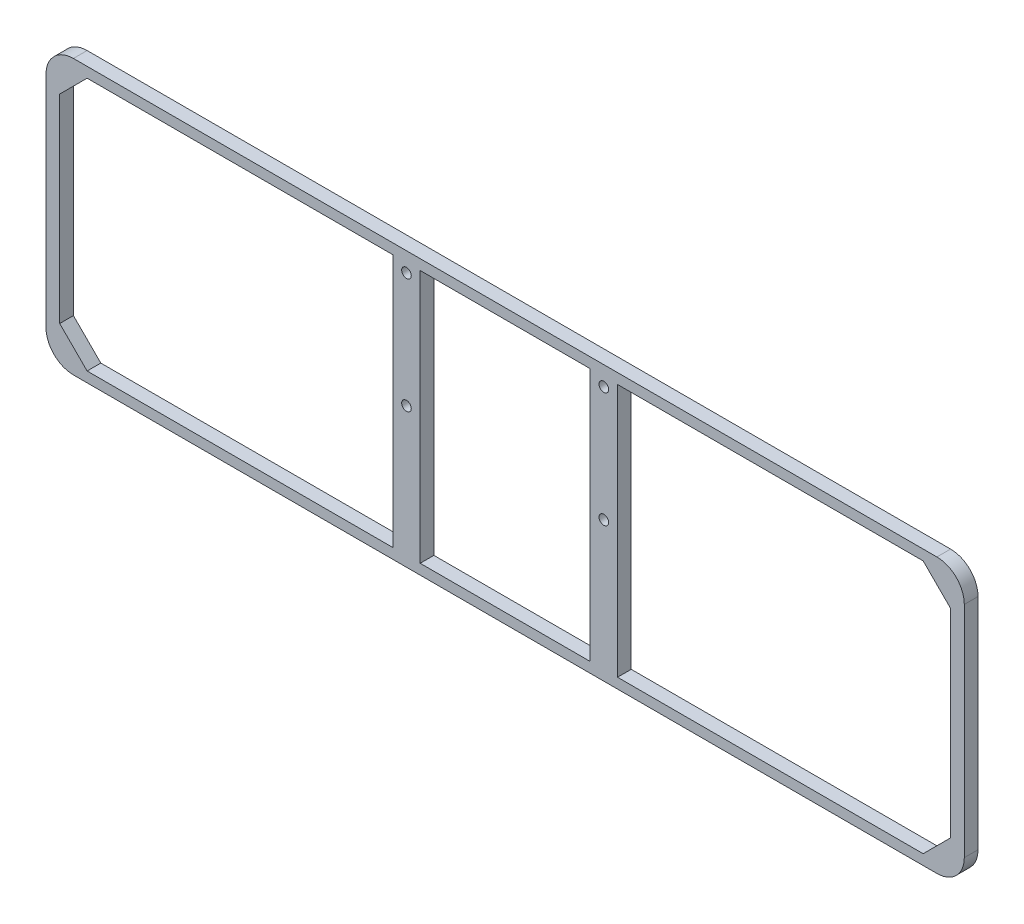
ISO-10303-21;
HEADER;
FILE_DESCRIPTION(('STEP AP214'),'2;1');
FILE_NAME('part.step','',(''),(''),'','','');
FILE_SCHEMA(('AUTOMOTIVE_DESIGN { 1 0 10303 214 1 1 1 1 }'));
ENDSEC;
DATA;
#1=APPLICATION_CONTEXT('core data for automotive mechanical design processes');
#2=APPLICATION_PROTOCOL_DEFINITION('international standard','automotive_design',2000,#1);
#3=PRODUCT_CONTEXT('',#1,'mechanical');
#4=PRODUCT('Part','Part','',(#3));
#5=PRODUCT_RELATED_PRODUCT_CATEGORY('part','',(#4));
#6=PRODUCT_DEFINITION_FORMATION('','',#4);
#7=PRODUCT_DEFINITION_CONTEXT('part definition',#1,'design');
#8=PRODUCT_DEFINITION('design','',#6,#7);
#9=PRODUCT_DEFINITION_SHAPE('','',#8);
#10=(LENGTH_UNIT() NAMED_UNIT(*) SI_UNIT(.MILLI.,.METRE.));
#11=(NAMED_UNIT(*) PLANE_ANGLE_UNIT() SI_UNIT($,.RADIAN.));
#12=(NAMED_UNIT(*) SI_UNIT($,.STERADIAN.) SOLID_ANGLE_UNIT());
#13=UNCERTAINTY_MEASURE_WITH_UNIT(LENGTH_MEASURE(1.E-05),#10,'distance_accuracy_value','');
#14=(GEOMETRIC_REPRESENTATION_CONTEXT(3) GLOBAL_UNCERTAINTY_ASSIGNED_CONTEXT((#13)) GLOBAL_UNIT_ASSIGNED_CONTEXT((#10,
#11,#12)) REPRESENTATION_CONTEXT('',''));
#15=CARTESIAN_POINT('',(0.,0.,0.));
#16=DIRECTION('',(0.,0.,1.));
#17=DIRECTION('',(1.,0.,0.));
#18=AXIS2_PLACEMENT_3D('',#15,#16,#17);
#19=CARTESIAN_POINT('',(167.5,-50.,-5.));
#20=DIRECTION('',(1.,0.,0.));
#21=DIRECTION('',(0.,0.,-1.));
#22=AXIS2_PLACEMENT_3D('',#19,#20,#21);
#23=PLANE('',#22);
#24=DIRECTION('',(0.,1.,0.));
#25=VECTOR('',#24,1.);
#26=CARTESIAN_POINT('',(167.5,-50.,0.));
#27=LINE('',#26,#25);
#28=CARTESIAN_POINT('',(167.5,-40.,0.));
#29=VERTEX_POINT('',#28);
#30=CARTESIAN_POINT('',(167.5,40.,0.));
#31=VERTEX_POINT('',#30);
#32=EDGE_CURVE('E332',#29,#31,#27,.T.);
#33=ORIENTED_EDGE('',*,*,#32,.F.);
#34=DIRECTION('',(0.,0.,1.));
#35=VECTOR('',#34,1.);
#36=CARTESIAN_POINT('',(167.5,-40.,-5.));
#37=LINE('',#36,#35);
#38=CARTESIAN_POINT('',(167.5,-40.,-5.));
#39=VERTEX_POINT('',#38);
#40=EDGE_CURVE('E390',#29,#39,#37,.F.);
#41=ORIENTED_EDGE('',*,*,#40,.T.);
#42=DIRECTION('',(0.,1.,0.));
#43=VECTOR('',#42,1.);
#44=CARTESIAN_POINT('',(167.5,-50.,-5.));
#45=LINE('',#44,#43);
#46=CARTESIAN_POINT('',(167.5,40.,-5.));
#47=VERTEX_POINT('',#46);
#48=EDGE_CURVE('E336',#39,#47,#45,.T.);
#49=ORIENTED_EDGE('',*,*,#48,.T.);
#50=DIRECTION('',(0.,0.,1.));
#51=VECTOR('',#50,1.);
#52=CARTESIAN_POINT('',(167.5,40.,-5.));
#53=LINE('',#52,#51);
#54=EDGE_CURVE('E386',#47,#31,#53,.T.);
#55=ORIENTED_EDGE('',*,*,#54,.T.);
#56=EDGE_LOOP('',(#33,#41,#49,#55));
#57=FACE_BOUND('',#56,.T.);
#58=ADVANCED_FACE('F42',(#57),#23,.T.);
#59=CARTESIAN_POINT('',(-167.5,-50.,-5.));
#60=DIRECTION('',(0.,-1.,0.));
#61=DIRECTION('',(0.,0.,-1.));
#62=AXIS2_PLACEMENT_3D('',#59,#60,#61);
#63=PLANE('',#62);
#64=DIRECTION('',(1.,0.,0.));
#65=VECTOR('',#64,1.);
#66=CARTESIAN_POINT('',(-167.5,-50.,-5.));
#67=LINE('',#66,#65);
#68=CARTESIAN_POINT('',(-157.5,-50.,-5.));
#69=VERTEX_POINT('',#68);
#70=CARTESIAN_POINT('',(157.5,-50.,-5.));
#71=VERTEX_POINT('',#70);
#72=EDGE_CURVE('E349',#69,#71,#67,.T.);
#73=ORIENTED_EDGE('',*,*,#72,.T.);
#74=DIRECTION('',(0.,0.,1.));
#75=VECTOR('',#74,1.);
#76=CARTESIAN_POINT('',(157.5,-50.,-5.));
#77=LINE('',#76,#75);
#78=CARTESIAN_POINT('',(157.5,-50.,0.));
#79=VERTEX_POINT('',#78);
#80=EDGE_CURVE('E370',#71,#79,#77,.T.);
#81=ORIENTED_EDGE('',*,*,#80,.T.);
#82=DIRECTION('',(1.,0.,0.));
#83=VECTOR('',#82,1.);
#84=CARTESIAN_POINT('',(-167.5,-50.,0.));
#85=LINE('',#84,#83);
#86=CARTESIAN_POINT('',(-157.5,-50.,0.));
#87=VERTEX_POINT('',#86);
#88=EDGE_CURVE('E341',#87,#79,#85,.T.);
#89=ORIENTED_EDGE('',*,*,#88,.F.);
#90=DIRECTION('',(0.,0.,1.));
#91=VECTOR('',#90,1.);
#92=CARTESIAN_POINT('',(-157.5,-50.,-5.));
#93=LINE('',#92,#91);
#94=EDGE_CURVE('E353',#87,#69,#93,.F.);
#95=ORIENTED_EDGE('',*,*,#94,.T.);
#96=EDGE_LOOP('',(#73,#81,#89,#95));
#97=FACE_BOUND('',#96,.T.);
#98=ADVANCED_FACE('F500',(#97),#63,.T.);
#99=CARTESIAN_POINT('',(-167.5,-50.,-5.));
#100=DIRECTION('',(-1.,0.,0.));
#101=DIRECTION('',(0.,0.,1.));
#102=AXIS2_PLACEMENT_3D('',#99,#100,#101);
#103=PLANE('',#102);
#104=DIRECTION('',(0.,-1.,0.));
#105=VECTOR('',#104,1.);
#106=CARTESIAN_POINT('',(-167.5,-50.,0.));
#107=LINE('',#106,#105);
#108=CARTESIAN_POINT('',(-167.5,40.,0.));
#109=VERTEX_POINT('',#108);
#110=CARTESIAN_POINT('',(-167.5,-40.,0.));
#111=VERTEX_POINT('',#110);
#112=EDGE_CURVE('E361',#109,#111,#107,.T.);
#113=ORIENTED_EDGE('',*,*,#112,.F.);
#114=DIRECTION('',(0.,0.,1.));
#115=VECTOR('',#114,1.);
#116=CARTESIAN_POINT('',(-167.5,40.,-5.));
#117=LINE('',#116,#115);
#118=CARTESIAN_POINT('',(-167.5,40.,-5.));
#119=VERTEX_POINT('',#118);
#120=EDGE_CURVE('E416',#109,#119,#117,.F.);
#121=ORIENTED_EDGE('',*,*,#120,.T.);
#122=DIRECTION('',(0.,-1.,0.));
#123=VECTOR('',#122,1.);
#124=CARTESIAN_POINT('',(-167.5,-50.,-5.));
#125=LINE('',#124,#123);
#126=CARTESIAN_POINT('',(-167.5,-40.,-5.));
#127=VERTEX_POINT('',#126);
#128=EDGE_CURVE('E345',#119,#127,#125,.T.);
#129=ORIENTED_EDGE('',*,*,#128,.T.);
#130=DIRECTION('',(0.,0.,1.));
#131=VECTOR('',#130,1.);
#132=CARTESIAN_POINT('',(-167.5,-40.,-5.));
#133=LINE('',#132,#131);
#134=EDGE_CURVE('E412',#127,#111,#133,.T.);
#135=ORIENTED_EDGE('',*,*,#134,.T.);
#136=EDGE_LOOP('',(#113,#121,#129,#135));
#137=FACE_BOUND('',#136,.T.);
#138=ADVANCED_FACE('F506',(#137),#103,.T.);
#139=CARTESIAN_POINT('',(-167.5,50.,-5.));
#140=DIRECTION('',(0.,1.,0.));
#141=DIRECTION('',(0.,0.,1.));
#142=AXIS2_PLACEMENT_3D('',#139,#140,#141);
#143=PLANE('',#142);
#144=DIRECTION('',(-1.,0.,0.));
#145=VECTOR('',#144,1.);
#146=CARTESIAN_POINT('',(-167.5,50.,0.));
#147=LINE('',#146,#145);
#148=CARTESIAN_POINT('',(157.5,50.,0.));
#149=VERTEX_POINT('',#148);
#150=CARTESIAN_POINT('',(-157.5,50.,0.));
#151=VERTEX_POINT('',#150);
#152=EDGE_CURVE('E357',#149,#151,#147,.T.);
#153=ORIENTED_EDGE('',*,*,#152,.F.);
#154=DIRECTION('',(0.,0.,1.));
#155=VECTOR('',#154,1.);
#156=CARTESIAN_POINT('',(157.5,50.,-5.));
#157=LINE('',#156,#155);
#158=CARTESIAN_POINT('',(157.5,50.,-5.));
#159=VERTEX_POINT('',#158);
#160=EDGE_CURVE('E409',#149,#159,#157,.F.);
#161=ORIENTED_EDGE('',*,*,#160,.T.);
#162=DIRECTION('',(-1.,0.,0.));
#163=VECTOR('',#162,1.);
#164=CARTESIAN_POINT('',(-167.5,50.,-5.));
#165=LINE('',#164,#163);
#166=CARTESIAN_POINT('',(-157.5,50.,-5.));
#167=VERTEX_POINT('',#166);
#168=EDGE_CURVE('E340',#159,#167,#165,.T.);
#169=ORIENTED_EDGE('',*,*,#168,.T.);
#170=DIRECTION('',(0.,0.,1.));
#171=VECTOR('',#170,1.);
#172=CARTESIAN_POINT('',(-157.5,50.,-5.));
#173=LINE('',#172,#171);
#174=EDGE_CURVE('E405',#167,#151,#173,.T.);
#175=ORIENTED_EDGE('',*,*,#174,.T.);
#176=EDGE_LOOP('',(#153,#161,#169,#175));
#177=FACE_BOUND('',#176,.T.);
#178=ADVANCED_FACE('F512',(#177),#143,.T.);
#179=CARTESIAN_POINT('',(0.,0.,-5.));
#180=DIRECTION('',(0.,0.,-1.));
#181=DIRECTION('',(-1.,0.,0.));
#182=AXIS2_PLACEMENT_3D('',#179,#180,#181);
#183=PLANE('',#182);
#184=CARTESIAN_POINT('',(-35.9999999999996,0.999999999999994,-5.));
#185=DIRECTION('',(0.,0.,1.));
#186=DIRECTION('',(1.,0.,0.));
#187=AXIS2_PLACEMENT_3D('',#184,#185,#186);
#188=CIRCLE('',#187,1.75);
#189=CARTESIAN_POINT('',(-34.2499999999996,0.999999999999994,-5.));
#190=VERTEX_POINT('',#189);
#191=EDGE_CURVE('E652',#190,#190,#188,.T.);
#192=ORIENTED_EDGE('',*,*,#191,.T.);
#193=EDGE_LOOP('',(#192));
#194=FACE_BOUND('',#193,.T.);
#195=CARTESIAN_POINT('',(36.0000000000004,0.999999999999994,-5.));
#196=DIRECTION('',(0.,0.,1.));
#197=DIRECTION('',(1.,0.,0.));
#198=AXIS2_PLACEMENT_3D('',#195,#196,#197);
#199=CIRCLE('',#198,1.75);
#200=CARTESIAN_POINT('',(37.7500000000004,0.999999999999994,-5.));
#201=VERTEX_POINT('',#200);
#202=EDGE_CURVE('E662',#201,#201,#199,.T.);
#203=ORIENTED_EDGE('',*,*,#202,.T.);
#204=EDGE_LOOP('',(#203));
#205=FACE_BOUND('',#204,.T.);
#206=CARTESIAN_POINT('',(36.,43.,-5.));
#207=DIRECTION('',(0.,0.,1.));
#208=DIRECTION('',(1.,0.,0.));
#209=AXIS2_PLACEMENT_3D('',#206,#207,#208);
#210=CIRCLE('',#209,1.75);
#211=CARTESIAN_POINT('',(37.75,43.,-5.));
#212=VERTEX_POINT('',#211);
#213=EDGE_CURVE('E670',#212,#212,#210,.T.);
#214=ORIENTED_EDGE('',*,*,#213,.T.);
#215=EDGE_LOOP('',(#214));
#216=FACE_BOUND('',#215,.T.);
#217=CARTESIAN_POINT('',(-36.,43.,-5.));
#218=DIRECTION('',(0.,0.,1.));
#219=DIRECTION('',(1.,0.,0.));
#220=AXIS2_PLACEMENT_3D('',#217,#218,#219);
#221=CIRCLE('',#220,1.75);
#222=CARTESIAN_POINT('',(-34.25,43.,-5.));
#223=VERTEX_POINT('',#222);
#224=EDGE_CURVE('E248',#223,#223,#221,.T.);
#225=ORIENTED_EDGE('',*,*,#224,.T.);
#226=EDGE_LOOP('',(#225));
#227=FACE_BOUND('',#226,.T.);
#228=DIRECTION('',(0.,-1.,0.));
#229=VECTOR('',#228,1.);
#230=CARTESIAN_POINT('',(-31.,-46.25,-5.));
#231=LINE('',#230,#229);
#232=CARTESIAN_POINT('',(-31.,46.25,-5.));
#233=VERTEX_POINT('',#232);
#234=CARTESIAN_POINT('',(-31.,-46.25,-5.));
#235=VERTEX_POINT('',#234);
#236=EDGE_CURVE('E208',#233,#235,#231,.T.);
#237=ORIENTED_EDGE('',*,*,#236,.T.);
#238=DIRECTION('',(1.,0.,0.));
#239=VECTOR('',#238,1.);
#240=CARTESIAN_POINT('',(-31.,-46.25,-5.));
#241=LINE('',#240,#239);
#242=CARTESIAN_POINT('',(31.,-46.25,-5.));
#243=VERTEX_POINT('',#242);
#244=EDGE_CURVE('E221',#235,#243,#241,.T.);
#245=ORIENTED_EDGE('',*,*,#244,.T.);
#246=DIRECTION('',(0.,1.,0.));
#247=VECTOR('',#246,1.);
#248=CARTESIAN_POINT('',(31.,46.25,-5.));
#249=LINE('',#248,#247);
#250=CARTESIAN_POINT('',(31.,46.25,-5.));
#251=VERTEX_POINT('',#250);
#252=EDGE_CURVE('E226',#243,#251,#249,.T.);
#253=ORIENTED_EDGE('',*,*,#252,.T.);
#254=DIRECTION('',(-1.,0.,0.));
#255=VECTOR('',#254,1.);
#256=CARTESIAN_POINT('',(-31.,46.25,-5.));
#257=LINE('',#256,#255);
#258=EDGE_CURVE('E217',#251,#233,#257,.T.);
#259=ORIENTED_EDGE('',*,*,#258,.T.);
#260=EDGE_LOOP('',(#237,#245,#253,#259));
#261=FACE_BOUND('',#260,.T.);
#262=DIRECTION('',(-1.,0.,0.));
#263=VECTOR('',#262,1.);
#264=CARTESIAN_POINT('',(-162.5,46.25,-5.));
#265=LINE('',#264,#263);
#266=CARTESIAN_POINT('',(-41.,46.25,-5.));
#267=VERTEX_POINT('',#266);
#268=CARTESIAN_POINT('',(-152.5,46.25,-5.));
#269=VERTEX_POINT('',#268);
#270=EDGE_CURVE('E274',#267,#269,#265,.T.);
#271=ORIENTED_EDGE('',*,*,#270,.T.);
#272=DIRECTION('',(0.707106781186544,0.707106781186551,0.));
#273=VECTOR('',#272,1.);
#274=CARTESIAN_POINT('',(-162.5,36.2499999999999,-5.));
#275=LINE('',#274,#273);
#276=CARTESIAN_POINT('',(-162.5,36.2499999999999,-5.));
#277=VERTEX_POINT('',#276);
#278=EDGE_CURVE('E461',#269,#277,#275,.F.);
#279=ORIENTED_EDGE('',*,*,#278,.T.);
#280=DIRECTION('',(0.,-1.,0.));
#281=VECTOR('',#280,1.);
#282=CARTESIAN_POINT('',(-162.5,-46.25,-5.));
#283=LINE('',#282,#281);
#284=CARTESIAN_POINT('',(-162.5,-36.25,-5.));
#285=VERTEX_POINT('',#284);
#286=EDGE_CURVE('E263',#277,#285,#283,.T.);
#287=ORIENTED_EDGE('',*,*,#286,.T.);
#288=DIRECTION('',(-0.70710678118655,0.707106781186545,0.));
#289=VECTOR('',#288,1.);
#290=CARTESIAN_POINT('',(-152.5,-46.25,-5.));
#291=LINE('',#290,#289);
#292=CARTESIAN_POINT('',(-152.5,-46.25,-5.));
#293=VERTEX_POINT('',#292);
#294=EDGE_CURVE('E11',#285,#293,#291,.F.);
#295=ORIENTED_EDGE('',*,*,#294,.T.);
#296=DIRECTION('',(1.,0.,0.));
#297=VECTOR('',#296,1.);
#298=CARTESIAN_POINT('',(-162.5,-46.25,-5.));
#299=LINE('',#298,#297);
#300=CARTESIAN_POINT('',(-41.,-46.25,-5.));
#301=VERTEX_POINT('',#300);
#302=EDGE_CURVE('E266',#293,#301,#299,.T.);
#303=ORIENTED_EDGE('',*,*,#302,.T.);
#304=DIRECTION('',(0.,1.,0.));
#305=VECTOR('',#304,1.);
#306=CARTESIAN_POINT('',(-41.,-46.25,-5.));
#307=LINE('',#306,#305);
#308=EDGE_CURVE('E270',#301,#267,#307,.T.);
#309=ORIENTED_EDGE('',*,*,#308,.T.);
#310=EDGE_LOOP('',(#271,#279,#287,#295,#303,#309));
#311=FACE_BOUND('',#310,.T.);
#312=DIRECTION('',(0.,1.,0.));
#313=VECTOR('',#312,1.);
#314=CARTESIAN_POINT('',(162.5,-46.25,-5.));
#315=LINE('',#314,#313);
#316=CARTESIAN_POINT('',(162.5,-36.2499999999999,-5.));
#317=VERTEX_POINT('',#316);
#318=CARTESIAN_POINT('',(162.5,36.2500000000001,-5.));
#319=VERTEX_POINT('',#318);
#320=EDGE_CURVE('E311',#317,#319,#315,.T.);
#321=ORIENTED_EDGE('',*,*,#320,.T.);
#322=DIRECTION('',(0.70710678118655,-0.707106781186545,0.));
#323=VECTOR('',#322,1.);
#324=CARTESIAN_POINT('',(152.5,46.25,-5.));
#325=LINE('',#324,#323);
#326=CARTESIAN_POINT('',(152.5,46.25,-5.));
#327=VERTEX_POINT('',#326);
#328=EDGE_CURVE('E455',#319,#327,#325,.F.);
#329=ORIENTED_EDGE('',*,*,#328,.T.);
#330=DIRECTION('',(-1.,0.,0.));
#331=VECTOR('',#330,1.);
#332=CARTESIAN_POINT('',(41.,46.25,-5.));
#333=LINE('',#332,#331);
#334=CARTESIAN_POINT('',(41.,46.25,-5.));
#335=VERTEX_POINT('',#334);
#336=EDGE_CURVE('E299',#327,#335,#333,.T.);
#337=ORIENTED_EDGE('',*,*,#336,.T.);
#338=DIRECTION('',(0.,-1.,0.));
#339=VECTOR('',#338,1.);
#340=CARTESIAN_POINT('',(41.,46.25,-5.));
#341=LINE('',#340,#339);
#342=CARTESIAN_POINT('',(41.,-46.25,-5.));
#343=VERTEX_POINT('',#342);
#344=EDGE_CURVE('E302',#335,#343,#341,.T.);
#345=ORIENTED_EDGE('',*,*,#344,.T.);
#346=DIRECTION('',(1.,0.,0.));
#347=VECTOR('',#346,1.);
#348=CARTESIAN_POINT('',(41.,-46.25,-5.));
#349=LINE('',#348,#347);
#350=CARTESIAN_POINT('',(152.5,-46.25,-5.));
#351=VERTEX_POINT('',#350);
#352=EDGE_CURVE('E307',#343,#351,#349,.T.);
#353=ORIENTED_EDGE('',*,*,#352,.T.);
#354=DIRECTION('',(-0.707106781186544,-0.707106781186551,0.));
#355=VECTOR('',#354,1.);
#356=CARTESIAN_POINT('',(162.5,-36.2499999999999,-5.));
#357=LINE('',#356,#355);
#358=EDGE_CURVE('E449',#351,#317,#357,.F.);
#359=ORIENTED_EDGE('',*,*,#358,.T.);
#360=EDGE_LOOP('',(#321,#329,#337,#345,#353,#359));
#361=FACE_BOUND('',#360,.T.);
#362=ORIENTED_EDGE('',*,*,#48,.F.);
#363=CARTESIAN_POINT('',(157.5,-40.,-5.));
#364=DIRECTION('',(0.,0.,-1.));
#365=DIRECTION('',(-1.,0.,0.));
#366=AXIS2_PLACEMENT_3D('',#363,#364,#365);
#367=CIRCLE('',#366,10.);
#368=EDGE_CURVE('E402',#39,#71,#367,.T.);
#369=ORIENTED_EDGE('',*,*,#368,.T.);
#370=ORIENTED_EDGE('',*,*,#72,.F.);
#371=CARTESIAN_POINT('',(-157.5,-40.,-5.));
#372=DIRECTION('',(0.,0.,-1.));
#373=DIRECTION('',(-1.,0.,0.));
#374=AXIS2_PLACEMENT_3D('',#371,#372,#373);
#375=CIRCLE('',#374,10.);
#376=EDGE_CURVE('E393',#69,#127,#375,.T.);
#377=ORIENTED_EDGE('',*,*,#376,.T.);
#378=ORIENTED_EDGE('',*,*,#128,.F.);
#379=CARTESIAN_POINT('',(-157.5,40.,-5.));
#380=DIRECTION('',(0.,0.,-1.));
#381=DIRECTION('',(-1.,0.,0.));
#382=AXIS2_PLACEMENT_3D('',#379,#380,#381);
#383=CIRCLE('',#382,10.);
#384=EDGE_CURVE('E396',#119,#167,#383,.T.);
#385=ORIENTED_EDGE('',*,*,#384,.T.);
#386=ORIENTED_EDGE('',*,*,#168,.F.);
#387=CARTESIAN_POINT('',(157.5,40.,-5.));
#388=DIRECTION('',(0.,0.,-1.));
#389=DIRECTION('',(-1.,0.,0.));
#390=AXIS2_PLACEMENT_3D('',#387,#388,#389);
#391=CIRCLE('',#390,10.);
#392=EDGE_CURVE('E399',#159,#47,#391,.T.);
#393=ORIENTED_EDGE('',*,*,#392,.T.);
#394=EDGE_LOOP('',(#362,#369,#370,#377,#378,#385,#386,#393));
#395=FACE_BOUND('',#394,.T.);
#396=ADVANCED_FACE('F228',(#194,#205,#216,#227,#261,#311,#361,#395),#183,.T.);
#397=CARTESIAN_POINT('',(0.,0.,0.));
#398=DIRECTION('',(0.,0.,-1.));
#399=DIRECTION('',(-1.,0.,0.));
#400=AXIS2_PLACEMENT_3D('',#397,#398,#399);
#401=PLANE('',#400);
#402=CARTESIAN_POINT('',(-35.9999999999996,0.999999999999994,0.));
#403=DIRECTION('',(0.,0.,1.));
#404=DIRECTION('',(1.,0.,0.));
#405=AXIS2_PLACEMENT_3D('',#402,#403,#404);
#406=CIRCLE('',#405,1.75);
#407=CARTESIAN_POINT('',(-34.2499999999996,0.999999999999994,0.));
#408=VERTEX_POINT('',#407);
#409=EDGE_CURVE('E655',#408,#408,#406,.T.);
#410=ORIENTED_EDGE('',*,*,#409,.F.);
#411=EDGE_LOOP('',(#410));
#412=FACE_BOUND('',#411,.T.);
#413=CARTESIAN_POINT('',(36.0000000000004,0.999999999999994,0.));
#414=DIRECTION('',(0.,0.,1.));
#415=DIRECTION('',(1.,0.,0.));
#416=AXIS2_PLACEMENT_3D('',#413,#414,#415);
#417=CIRCLE('',#416,1.75);
#418=CARTESIAN_POINT('',(37.7500000000004,0.999999999999994,0.));
#419=VERTEX_POINT('',#418);
#420=EDGE_CURVE('E659',#419,#419,#417,.T.);
#421=ORIENTED_EDGE('',*,*,#420,.F.);
#422=EDGE_LOOP('',(#421));
#423=FACE_BOUND('',#422,.T.);
#424=CARTESIAN_POINT('',(36.,43.,0.));
#425=DIRECTION('',(0.,0.,1.));
#426=DIRECTION('',(1.,0.,0.));
#427=AXIS2_PLACEMENT_3D('',#424,#425,#426);
#428=CIRCLE('',#427,1.75);
#429=CARTESIAN_POINT('',(37.75,43.,0.));
#430=VERTEX_POINT('',#429);
#431=EDGE_CURVE('E666',#430,#430,#428,.T.);
#432=ORIENTED_EDGE('',*,*,#431,.F.);
#433=EDGE_LOOP('',(#432));
#434=FACE_BOUND('',#433,.T.);
#435=CARTESIAN_POINT('',(-36.,43.,0.));
#436=DIRECTION('',(0.,0.,1.));
#437=DIRECTION('',(1.,0.,0.));
#438=AXIS2_PLACEMENT_3D('',#435,#436,#437);
#439=CIRCLE('',#438,1.75);
#440=CARTESIAN_POINT('',(-34.25,43.,0.));
#441=VERTEX_POINT('',#440);
#442=EDGE_CURVE('E238',#441,#441,#439,.T.);
#443=ORIENTED_EDGE('',*,*,#442,.F.);
#444=EDGE_LOOP('',(#443));
#445=FACE_BOUND('',#444,.T.);
#446=DIRECTION('',(1.,0.,0.));
#447=VECTOR('',#446,1.);
#448=CARTESIAN_POINT('',(-31.,-46.25,0.));
#449=LINE('',#448,#447);
#450=CARTESIAN_POINT('',(-31.,-46.25,0.));
#451=VERTEX_POINT('',#450);
#452=CARTESIAN_POINT('',(31.,-46.25,0.));
#453=VERTEX_POINT('',#452);
#454=EDGE_CURVE('E247',#451,#453,#449,.T.);
#455=ORIENTED_EDGE('',*,*,#454,.F.);
#456=DIRECTION('',(0.,-1.,0.));
#457=VECTOR('',#456,1.);
#458=CARTESIAN_POINT('',(-31.,-46.25,0.));
#459=LINE('',#458,#457);
#460=CARTESIAN_POINT('',(-31.,46.25,0.));
#461=VERTEX_POINT('',#460);
#462=EDGE_CURVE('E211',#461,#451,#459,.T.);
#463=ORIENTED_EDGE('',*,*,#462,.F.);
#464=DIRECTION('',(-1.,0.,0.));
#465=VECTOR('',#464,1.);
#466=CARTESIAN_POINT('',(-31.,46.25,0.));
#467=LINE('',#466,#465);
#468=CARTESIAN_POINT('',(31.,46.25,0.));
#469=VERTEX_POINT('',#468);
#470=EDGE_CURVE('E231',#469,#461,#467,.T.);
#471=ORIENTED_EDGE('',*,*,#470,.F.);
#472=DIRECTION('',(0.,1.,0.));
#473=VECTOR('',#472,1.);
#474=CARTESIAN_POINT('',(31.,46.25,0.));
#475=LINE('',#474,#473);
#476=EDGE_CURVE('E235',#453,#469,#475,.T.);
#477=ORIENTED_EDGE('',*,*,#476,.F.);
#478=EDGE_LOOP('',(#455,#463,#471,#477));
#479=FACE_BOUND('',#478,.T.);
#480=DIRECTION('',(1.,0.,0.));
#481=VECTOR('',#480,1.);
#482=CARTESIAN_POINT('',(-162.5,-46.25,0.));
#483=LINE('',#482,#481);
#484=CARTESIAN_POINT('',(-152.5,-46.25,0.));
#485=VERTEX_POINT('',#484);
#486=CARTESIAN_POINT('',(-41.,-46.25,0.));
#487=VERTEX_POINT('',#486);
#488=EDGE_CURVE('E282',#485,#487,#483,.T.);
#489=ORIENTED_EDGE('',*,*,#488,.F.);
#490=DIRECTION('',(0.70710678118655,-0.707106781186545,0.));
#491=VECTOR('',#490,1.);
#492=CARTESIAN_POINT('',(-99.3749999999993,-99.3750000000002,0.));
#493=LINE('',#492,#491);
#494=CARTESIAN_POINT('',(-162.5,-36.25,0.));
#495=VERTEX_POINT('',#494);
#496=EDGE_CURVE('E52',#485,#495,#493,.F.);
#497=ORIENTED_EDGE('',*,*,#496,.T.);
#498=DIRECTION('',(0.,-1.,0.));
#499=VECTOR('',#498,1.);
#500=CARTESIAN_POINT('',(-162.5,-46.25,0.));
#501=LINE('',#500,#499);
#502=CARTESIAN_POINT('',(-162.5,36.2499999999999,0.));
#503=VERTEX_POINT('',#502);
#504=EDGE_CURVE('E257',#503,#495,#501,.T.);
#505=ORIENTED_EDGE('',*,*,#504,.F.);
#506=DIRECTION('',(-0.707106781186544,-0.707106781186551,0.));
#507=VECTOR('',#506,1.);
#508=CARTESIAN_POINT('',(-99.3750000000008,99.3749999999997,0.));
#509=LINE('',#508,#507);
#510=CARTESIAN_POINT('',(-152.5,46.25,0.));
#511=VERTEX_POINT('',#510);
#512=EDGE_CURVE('E458',#503,#511,#509,.F.);
#513=ORIENTED_EDGE('',*,*,#512,.T.);
#514=DIRECTION('',(-1.,0.,0.));
#515=VECTOR('',#514,1.);
#516=CARTESIAN_POINT('',(-162.5,46.25,0.));
#517=LINE('',#516,#515);
#518=CARTESIAN_POINT('',(-41.,46.25,0.));
#519=VERTEX_POINT('',#518);
#520=EDGE_CURVE('E267',#519,#511,#517,.T.);
#521=ORIENTED_EDGE('',*,*,#520,.F.);
#522=DIRECTION('',(0.,1.,0.));
#523=VECTOR('',#522,1.);
#524=CARTESIAN_POINT('',(-41.,-46.25,0.));
#525=LINE('',#524,#523);
#526=EDGE_CURVE('E285',#487,#519,#525,.T.);
#527=ORIENTED_EDGE('',*,*,#526,.F.);
#528=EDGE_LOOP('',(#489,#497,#505,#513,#521,#527));
#529=FACE_BOUND('',#528,.T.);
#530=DIRECTION('',(0.,-1.,0.));
#531=VECTOR('',#530,1.);
#532=CARTESIAN_POINT('',(41.,46.25,0.));
#533=LINE('',#532,#531);
#534=CARTESIAN_POINT('',(41.,46.25,0.));
#535=VERTEX_POINT('',#534);
#536=CARTESIAN_POINT('',(41.,-46.25,0.));
#537=VERTEX_POINT('',#536);
#538=EDGE_CURVE('E318',#535,#537,#533,.T.);
#539=ORIENTED_EDGE('',*,*,#538,.F.);
#540=DIRECTION('',(-1.,0.,0.));
#541=VECTOR('',#540,1.);
#542=CARTESIAN_POINT('',(41.,46.25,0.));
#543=LINE('',#542,#541);
#544=CARTESIAN_POINT('',(152.5,46.25,0.));
#545=VERTEX_POINT('',#544);
#546=EDGE_CURVE('E295',#545,#535,#543,.T.);
#547=ORIENTED_EDGE('',*,*,#546,.F.);
#548=DIRECTION('',(-0.70710678118655,0.707106781186545,0.));
#549=VECTOR('',#548,1.);
#550=CARTESIAN_POINT('',(99.3749999999994,99.3750000000002,0.));
#551=LINE('',#550,#549);
#552=CARTESIAN_POINT('',(162.5,36.2500000000001,0.));
#553=VERTEX_POINT('',#552);
#554=EDGE_CURVE('E452',#545,#553,#551,.F.);
#555=ORIENTED_EDGE('',*,*,#554,.T.);
#556=DIRECTION('',(0.,1.,0.));
#557=VECTOR('',#556,1.);
#558=CARTESIAN_POINT('',(162.5,-46.25,0.));
#559=LINE('',#558,#557);
#560=CARTESIAN_POINT('',(162.5,-36.2499999999999,0.));
#561=VERTEX_POINT('',#560);
#562=EDGE_CURVE('E303',#561,#553,#559,.T.);
#563=ORIENTED_EDGE('',*,*,#562,.F.);
#564=DIRECTION('',(0.707106781186544,0.707106781186551,0.));
#565=VECTOR('',#564,1.);
#566=CARTESIAN_POINT('',(99.3750000000009,-99.3749999999998,0.));
#567=LINE('',#566,#565);
#568=CARTESIAN_POINT('',(152.5,-46.25,0.));
#569=VERTEX_POINT('',#568);
#570=EDGE_CURVE('E446',#561,#569,#567,.F.);
#571=ORIENTED_EDGE('',*,*,#570,.T.);
#572=DIRECTION('',(1.,0.,0.));
#573=VECTOR('',#572,1.);
#574=CARTESIAN_POINT('',(41.,-46.25,0.));
#575=LINE('',#574,#573);
#576=EDGE_CURVE('E322',#537,#569,#575,.T.);
#577=ORIENTED_EDGE('',*,*,#576,.F.);
#578=EDGE_LOOP('',(#539,#547,#555,#563,#571,#577));
#579=FACE_BOUND('',#578,.T.);
#580=ORIENTED_EDGE('',*,*,#88,.T.);
#581=CARTESIAN_POINT('',(157.5,-40.,0.));
#582=DIRECTION('',(0.,0.,-1.));
#583=DIRECTION('',(-1.,0.,0.));
#584=AXIS2_PLACEMENT_3D('',#581,#582,#583);
#585=CIRCLE('',#584,10.);
#586=EDGE_CURVE('E383',#79,#29,#585,.F.);
#587=ORIENTED_EDGE('',*,*,#586,.T.);
#588=ORIENTED_EDGE('',*,*,#32,.T.);
#589=CARTESIAN_POINT('',(157.5,40.,0.));
#590=DIRECTION('',(0.,0.,-1.));
#591=DIRECTION('',(-1.,0.,0.));
#592=AXIS2_PLACEMENT_3D('',#589,#590,#591);
#593=CIRCLE('',#592,10.);
#594=EDGE_CURVE('E380',#31,#149,#593,.F.);
#595=ORIENTED_EDGE('',*,*,#594,.T.);
#596=ORIENTED_EDGE('',*,*,#152,.T.);
#597=CARTESIAN_POINT('',(-157.5,40.,0.));
#598=DIRECTION('',(0.,0.,-1.));
#599=DIRECTION('',(-1.,0.,0.));
#600=AXIS2_PLACEMENT_3D('',#597,#598,#599);
#601=CIRCLE('',#600,10.);
#602=EDGE_CURVE('E377',#151,#109,#601,.F.);
#603=ORIENTED_EDGE('',*,*,#602,.T.);
#604=ORIENTED_EDGE('',*,*,#112,.T.);
#605=CARTESIAN_POINT('',(-157.5,-40.,0.));
#606=DIRECTION('',(0.,0.,-1.));
#607=DIRECTION('',(-1.,0.,0.));
#608=AXIS2_PLACEMENT_3D('',#605,#606,#607);
#609=CIRCLE('',#608,10.);
#610=EDGE_CURVE('E374',#111,#87,#609,.F.);
#611=ORIENTED_EDGE('',*,*,#610,.T.);
#612=EDGE_LOOP('',(#580,#587,#588,#595,#596,#603,#604,#611));
#613=FACE_BOUND('',#612,.T.);
#614=ADVANCED_FACE('F467',(#412,#423,#434,#445,#479,#529,#579,#613),#401,.F.);
#615=CARTESIAN_POINT('',(41.,46.25,-5.));
#616=DIRECTION('',(0.,1.,0.));
#617=DIRECTION('',(0.,0.,1.));
#618=AXIS2_PLACEMENT_3D('',#615,#616,#617);
#619=PLANE('',#618);
#620=ORIENTED_EDGE('',*,*,#336,.F.);
#621=DIRECTION('',(0.,0.,1.));
#622=VECTOR('',#621,1.);
#623=CARTESIAN_POINT('',(152.5,46.25,0.));
#624=LINE('',#623,#622);
#625=EDGE_CURVE('E429',#327,#545,#624,.T.);
#626=ORIENTED_EDGE('',*,*,#625,.T.);
#627=ORIENTED_EDGE('',*,*,#546,.T.);
#628=DIRECTION('',(0.,0.,1.));
#629=VECTOR('',#628,1.);
#630=CARTESIAN_POINT('',(41.,46.25,-5.));
#631=LINE('',#630,#629);
#632=EDGE_CURVE('E315',#335,#535,#631,.T.);
#633=ORIENTED_EDGE('',*,*,#632,.F.);
#634=EDGE_LOOP('',(#620,#626,#627,#633));
#635=FACE_BOUND('',#634,.T.);
#636=ADVANCED_FACE('F559',(#635),#619,.F.);
#637=CARTESIAN_POINT('',(162.5,-46.25,-5.));
#638=DIRECTION('',(1.,0.,0.));
#639=DIRECTION('',(0.,0.,-1.));
#640=AXIS2_PLACEMENT_3D('',#637,#638,#639);
#641=PLANE('',#640);
#642=ORIENTED_EDGE('',*,*,#320,.F.);
#643=DIRECTION('',(0.,0.,1.));
#644=VECTOR('',#643,1.);
#645=CARTESIAN_POINT('',(162.5,-36.2499999999999,0.));
#646=LINE('',#645,#644);
#647=EDGE_CURVE('E422',#317,#561,#646,.T.);
#648=ORIENTED_EDGE('',*,*,#647,.T.);
#649=ORIENTED_EDGE('',*,*,#562,.T.);
#650=DIRECTION('',(0.,0.,-1.));
#651=VECTOR('',#650,1.);
#652=CARTESIAN_POINT('',(162.5,36.2500000000001,-5.));
#653=LINE('',#652,#651);
#654=EDGE_CURVE('E419',#553,#319,#653,.T.);
#655=ORIENTED_EDGE('',*,*,#654,.T.);
#656=EDGE_LOOP('',(#642,#648,#649,#655));
#657=FACE_BOUND('',#656,.T.);
#658=ADVANCED_FACE('F552',(#657),#641,.F.);
#659=CARTESIAN_POINT('',(41.,-46.25,-5.));
#660=DIRECTION('',(0.,-1.,0.));
#661=DIRECTION('',(0.,0.,-1.));
#662=AXIS2_PLACEMENT_3D('',#659,#660,#661);
#663=PLANE('',#662);
#664=ORIENTED_EDGE('',*,*,#576,.T.);
#665=DIRECTION('',(0.,0.,-1.));
#666=VECTOR('',#665,1.);
#667=CARTESIAN_POINT('',(152.5,-46.25,-5.));
#668=LINE('',#667,#666);
#669=EDGE_CURVE('E426',#569,#351,#668,.T.);
#670=ORIENTED_EDGE('',*,*,#669,.T.);
#671=ORIENTED_EDGE('',*,*,#352,.F.);
#672=DIRECTION('',(0.,0.,1.));
#673=VECTOR('',#672,1.);
#674=CARTESIAN_POINT('',(41.,-46.25,-5.));
#675=LINE('',#674,#673);
#676=EDGE_CURVE('E329',#343,#537,#675,.T.);
#677=ORIENTED_EDGE('',*,*,#676,.T.);
#678=EDGE_LOOP('',(#664,#670,#671,#677));
#679=FACE_BOUND('',#678,.T.);
#680=ADVANCED_FACE('F568',(#679),#663,.F.);
#681=CARTESIAN_POINT('',(41.,46.25,-5.));
#682=DIRECTION('',(-1.,0.,0.));
#683=DIRECTION('',(0.,-1.,0.));
#684=AXIS2_PLACEMENT_3D('',#681,#682,#683);
#685=PLANE('',#684);
#686=ORIENTED_EDGE('',*,*,#538,.T.);
#687=ORIENTED_EDGE('',*,*,#676,.F.);
#688=ORIENTED_EDGE('',*,*,#344,.F.);
#689=ORIENTED_EDGE('',*,*,#632,.T.);
#690=EDGE_LOOP('',(#686,#687,#688,#689));
#691=FACE_BOUND('',#690,.T.);
#692=ADVANCED_FACE('F565',(#691),#685,.F.);
#693=CARTESIAN_POINT('',(-162.5,-46.25,-5.));
#694=DIRECTION('',(-1.,0.,0.));
#695=DIRECTION('',(0.,0.,1.));
#696=AXIS2_PLACEMENT_3D('',#693,#694,#695);
#697=PLANE('',#696);
#698=ORIENTED_EDGE('',*,*,#286,.F.);
#699=DIRECTION('',(0.,0.,1.));
#700=VECTOR('',#699,1.);
#701=CARTESIAN_POINT('',(-162.5,36.2499999999999,0.));
#702=LINE('',#701,#700);
#703=EDGE_CURVE('E436',#277,#503,#702,.T.);
#704=ORIENTED_EDGE('',*,*,#703,.T.);
#705=ORIENTED_EDGE('',*,*,#504,.T.);
#706=DIRECTION('',(0.,0.,-1.));
#707=VECTOR('',#706,1.);
#708=CARTESIAN_POINT('',(-162.5,-36.25,-5.));
#709=LINE('',#708,#707);
#710=EDGE_CURVE('E433',#495,#285,#709,.T.);
#711=ORIENTED_EDGE('',*,*,#710,.T.);
#712=EDGE_LOOP('',(#698,#704,#705,#711));
#713=FACE_BOUND('',#712,.T.);
#714=ADVANCED_FACE('F472',(#713),#697,.F.);
#715=CARTESIAN_POINT('',(-162.5,46.25,-5.));
#716=DIRECTION('',(0.,1.,0.));
#717=DIRECTION('',(0.,0.,1.));
#718=AXIS2_PLACEMENT_3D('',#715,#716,#717);
#719=PLANE('',#718);
#720=ORIENTED_EDGE('',*,*,#520,.T.);
#721=DIRECTION('',(0.,0.,-1.));
#722=VECTOR('',#721,1.);
#723=CARTESIAN_POINT('',(-152.5,46.25,-5.));
#724=LINE('',#723,#722);
#725=EDGE_CURVE('E440',#511,#269,#724,.T.);
#726=ORIENTED_EDGE('',*,*,#725,.T.);
#727=ORIENTED_EDGE('',*,*,#270,.F.);
#728=DIRECTION('',(0.,0.,1.));
#729=VECTOR('',#728,1.);
#730=CARTESIAN_POINT('',(-41.,46.25,-5.));
#731=LINE('',#730,#729);
#732=EDGE_CURVE('E292',#267,#519,#731,.T.);
#733=ORIENTED_EDGE('',*,*,#732,.T.);
#734=EDGE_LOOP('',(#720,#726,#727,#733));
#735=FACE_BOUND('',#734,.T.);
#736=ADVANCED_FACE('F484',(#735),#719,.F.);
#737=CARTESIAN_POINT('',(-41.,-46.25,-5.));
#738=DIRECTION('',(1.,0.,0.));
#739=DIRECTION('',(0.,0.,-1.));
#740=AXIS2_PLACEMENT_3D('',#737,#738,#739);
#741=PLANE('',#740);
#742=ORIENTED_EDGE('',*,*,#526,.T.);
#743=ORIENTED_EDGE('',*,*,#732,.F.);
#744=ORIENTED_EDGE('',*,*,#308,.F.);
#745=DIRECTION('',(0.,0.,1.));
#746=VECTOR('',#745,1.);
#747=CARTESIAN_POINT('',(-41.,-46.25,-5.));
#748=LINE('',#747,#746);
#749=EDGE_CURVE('E278',#301,#487,#748,.T.);
#750=ORIENTED_EDGE('',*,*,#749,.T.);
#751=EDGE_LOOP('',(#742,#743,#744,#750));
#752=FACE_BOUND('',#751,.T.);
#753=ADVANCED_FACE('F480',(#752),#741,.F.);
#754=CARTESIAN_POINT('',(-162.5,-46.25,-5.));
#755=DIRECTION('',(0.,-1.,0.));
#756=DIRECTION('',(0.,0.,-1.));
#757=AXIS2_PLACEMENT_3D('',#754,#755,#756);
#758=PLANE('',#757);
#759=ORIENTED_EDGE('',*,*,#302,.F.);
#760=DIRECTION('',(0.,0.,1.));
#761=VECTOR('',#760,1.);
#762=CARTESIAN_POINT('',(-152.5,-46.25,0.));
#763=LINE('',#762,#761);
#764=EDGE_CURVE('E443',#293,#485,#763,.T.);
#765=ORIENTED_EDGE('',*,*,#764,.T.);
#766=ORIENTED_EDGE('',*,*,#488,.T.);
#767=ORIENTED_EDGE('',*,*,#749,.F.);
#768=EDGE_LOOP('',(#759,#765,#766,#767));
#769=FACE_BOUND('',#768,.T.);
#770=ADVANCED_FACE('F475',(#769),#758,.F.);
#771=CARTESIAN_POINT('',(-31.,-46.25,-5.));
#772=DIRECTION('',(-1.,0.,0.));
#773=DIRECTION('',(0.,0.,1.));
#774=AXIS2_PLACEMENT_3D('',#771,#772,#773);
#775=PLANE('',#774);
#776=ORIENTED_EDGE('',*,*,#462,.T.);
#777=DIRECTION('',(0.,0.,1.));
#778=VECTOR('',#777,1.);
#779=CARTESIAN_POINT('',(-31.,-46.25,-5.));
#780=LINE('',#779,#778);
#781=EDGE_CURVE('E204',#235,#451,#780,.T.);
#782=ORIENTED_EDGE('',*,*,#781,.F.);
#783=ORIENTED_EDGE('',*,*,#236,.F.);
#784=DIRECTION('',(0.,0.,1.));
#785=VECTOR('',#784,1.);
#786=CARTESIAN_POINT('',(-31.,46.25,-5.));
#787=LINE('',#786,#785);
#788=EDGE_CURVE('E254',#233,#461,#787,.T.);
#789=ORIENTED_EDGE('',*,*,#788,.T.);
#790=EDGE_LOOP('',(#776,#782,#783,#789));
#791=FACE_BOUND('',#790,.T.);
#792=ADVANCED_FACE('F206',(#791),#775,.F.);
#793=CARTESIAN_POINT('',(-31.,46.25,-5.));
#794=DIRECTION('',(0.,1.,0.));
#795=DIRECTION('',(0.,0.,1.));
#796=AXIS2_PLACEMENT_3D('',#793,#794,#795);
#797=PLANE('',#796);
#798=ORIENTED_EDGE('',*,*,#470,.T.);
#799=ORIENTED_EDGE('',*,*,#788,.F.);
#800=ORIENTED_EDGE('',*,*,#258,.F.);
#801=DIRECTION('',(0.,0.,1.));
#802=VECTOR('',#801,1.);
#803=CARTESIAN_POINT('',(31.,46.25,-5.));
#804=LINE('',#803,#802);
#805=EDGE_CURVE('E258',#251,#469,#804,.T.);
#806=ORIENTED_EDGE('',*,*,#805,.T.);
#807=EDGE_LOOP('',(#798,#799,#800,#806));
#808=FACE_BOUND('',#807,.T.);
#809=ADVANCED_FACE('F623',(#808),#797,.F.);
#810=CARTESIAN_POINT('',(31.,46.25,-5.));
#811=DIRECTION('',(1.,0.,0.));
#812=DIRECTION('',(0.,1.,0.));
#813=AXIS2_PLACEMENT_3D('',#810,#811,#812);
#814=PLANE('',#813);
#815=ORIENTED_EDGE('',*,*,#476,.T.);
#816=ORIENTED_EDGE('',*,*,#805,.F.);
#817=ORIENTED_EDGE('',*,*,#252,.F.);
#818=DIRECTION('',(0.,0.,1.));
#819=VECTOR('',#818,1.);
#820=CARTESIAN_POINT('',(31.,-46.25,-5.));
#821=LINE('',#820,#819);
#822=EDGE_CURVE('E216',#243,#453,#821,.T.);
#823=ORIENTED_EDGE('',*,*,#822,.T.);
#824=EDGE_LOOP('',(#815,#816,#817,#823));
#825=FACE_BOUND('',#824,.T.);
#826=ADVANCED_FACE('F627',(#825),#814,.F.);
#827=CARTESIAN_POINT('',(-31.,-46.25,-5.));
#828=DIRECTION('',(0.,-1.,0.));
#829=DIRECTION('',(0.,0.,-1.));
#830=AXIS2_PLACEMENT_3D('',#827,#828,#829);
#831=PLANE('',#830);
#832=ORIENTED_EDGE('',*,*,#454,.T.);
#833=ORIENTED_EDGE('',*,*,#822,.F.);
#834=ORIENTED_EDGE('',*,*,#244,.F.);
#835=ORIENTED_EDGE('',*,*,#781,.T.);
#836=EDGE_LOOP('',(#832,#833,#834,#835));
#837=FACE_BOUND('',#836,.T.);
#838=ADVANCED_FACE('F222',(#837),#831,.F.);
#839=CARTESIAN_POINT('',(-36.,43.,-5.));
#840=DIRECTION('',(0.,0.,1.));
#841=DIRECTION('',(1.,0.,0.));
#842=AXIS2_PLACEMENT_3D('',#839,#840,#841);
#843=CYLINDRICAL_SURFACE('',#842,1.75);
#844=ORIENTED_EDGE('',*,*,#224,.F.);
#845=EDGE_LOOP('',(#844));
#846=FACE_BOUND('',#845,.T.);
#847=ORIENTED_EDGE('',*,*,#442,.T.);
#848=EDGE_LOOP('',(#847));
#849=FACE_BOUND('',#848,.T.);
#850=ADVANCED_FACE('F626',(#846,#849),#843,.F.);
#851=CARTESIAN_POINT('',(36.,43.,-5.));
#852=DIRECTION('',(0.,0.,1.));
#853=DIRECTION('',(1.,0.,0.));
#854=AXIS2_PLACEMENT_3D('',#851,#852,#853);
#855=CYLINDRICAL_SURFACE('',#854,1.75);
#856=ORIENTED_EDGE('',*,*,#213,.F.);
#857=EDGE_LOOP('',(#856));
#858=FACE_BOUND('',#857,.T.);
#859=ORIENTED_EDGE('',*,*,#431,.T.);
#860=EDGE_LOOP('',(#859));
#861=FACE_BOUND('',#860,.T.);
#862=ADVANCED_FACE('F636',(#858,#861),#855,.F.);
#863=CARTESIAN_POINT('',(36.0000000000004,0.999999999999994,-5.));
#864=DIRECTION('',(0.,0.,1.));
#865=DIRECTION('',(1.,0.,0.));
#866=AXIS2_PLACEMENT_3D('',#863,#864,#865);
#867=CYLINDRICAL_SURFACE('',#866,1.75);
#868=ORIENTED_EDGE('',*,*,#202,.F.);
#869=EDGE_LOOP('',(#868));
#870=FACE_BOUND('',#869,.T.);
#871=ORIENTED_EDGE('',*,*,#420,.T.);
#872=EDGE_LOOP('',(#871));
#873=FACE_BOUND('',#872,.T.);
#874=ADVANCED_FACE('F640',(#870,#873),#867,.F.);
#875=CARTESIAN_POINT('',(-35.9999999999996,0.999999999999994,-5.));
#876=DIRECTION('',(0.,0.,1.));
#877=DIRECTION('',(1.,0.,0.));
#878=AXIS2_PLACEMENT_3D('',#875,#876,#877);
#879=CYLINDRICAL_SURFACE('',#878,1.75);
#880=ORIENTED_EDGE('',*,*,#191,.F.);
#881=EDGE_LOOP('',(#880));
#882=FACE_BOUND('',#881,.T.);
#883=ORIENTED_EDGE('',*,*,#409,.T.);
#884=EDGE_LOOP('',(#883));
#885=FACE_BOUND('',#884,.T.);
#886=ADVANCED_FACE('F518',(#882,#885),#879,.F.);
#887=CARTESIAN_POINT('',(157.5,-40.,-5.));
#888=DIRECTION('',(0.,0.,1.));
#889=DIRECTION('',(1.,0.,0.));
#890=AXIS2_PLACEMENT_3D('',#887,#888,#889);
#891=CYLINDRICAL_SURFACE('',#890,10.);
#892=ORIENTED_EDGE('',*,*,#368,.F.);
#893=ORIENTED_EDGE('',*,*,#40,.F.);
#894=ORIENTED_EDGE('',*,*,#586,.F.);
#895=ORIENTED_EDGE('',*,*,#80,.F.);
#896=EDGE_LOOP('',(#892,#893,#894,#895));
#897=FACE_BOUND('',#896,.T.);
#898=ADVANCED_FACE('F514',(#897),#891,.T.);
#899=CARTESIAN_POINT('',(157.5,40.,-5.));
#900=DIRECTION('',(0.,0.,1.));
#901=DIRECTION('',(1.,0.,0.));
#902=AXIS2_PLACEMENT_3D('',#899,#900,#901);
#903=CYLINDRICAL_SURFACE('',#902,10.);
#904=ORIENTED_EDGE('',*,*,#392,.F.);
#905=ORIENTED_EDGE('',*,*,#160,.F.);
#906=ORIENTED_EDGE('',*,*,#594,.F.);
#907=ORIENTED_EDGE('',*,*,#54,.F.);
#908=EDGE_LOOP('',(#904,#905,#906,#907));
#909=FACE_BOUND('',#908,.T.);
#910=ADVANCED_FACE('F517',(#909),#903,.T.);
#911=CARTESIAN_POINT('',(-157.5,40.,-5.));
#912=DIRECTION('',(0.,0.,1.));
#913=DIRECTION('',(1.,0.,0.));
#914=AXIS2_PLACEMENT_3D('',#911,#912,#913);
#915=CYLINDRICAL_SURFACE('',#914,10.);
#916=ORIENTED_EDGE('',*,*,#384,.F.);
#917=ORIENTED_EDGE('',*,*,#120,.F.);
#918=ORIENTED_EDGE('',*,*,#602,.F.);
#919=ORIENTED_EDGE('',*,*,#174,.F.);
#920=EDGE_LOOP('',(#916,#917,#918,#919));
#921=FACE_BOUND('',#920,.T.);
#922=ADVANCED_FACE('F522',(#921),#915,.T.);
#923=CARTESIAN_POINT('',(-157.5,-40.,-5.));
#924=DIRECTION('',(0.,0.,1.));
#925=DIRECTION('',(1.,0.,0.));
#926=AXIS2_PLACEMENT_3D('',#923,#924,#925);
#927=CYLINDRICAL_SURFACE('',#926,10.);
#928=ORIENTED_EDGE('',*,*,#376,.F.);
#929=ORIENTED_EDGE('',*,*,#94,.F.);
#930=ORIENTED_EDGE('',*,*,#610,.F.);
#931=ORIENTED_EDGE('',*,*,#134,.F.);
#932=EDGE_LOOP('',(#928,#929,#930,#931));
#933=FACE_BOUND('',#932,.T.);
#934=ADVANCED_FACE('F526',(#933),#927,.T.);
#935=CARTESIAN_POINT('',(162.5,-36.2499999999999,-5.));
#936=DIRECTION('',(-0.707106781186551,0.707106781186543,0.));
#937=DIRECTION('',(0.,0.,-1.));
#938=AXIS2_PLACEMENT_3D('',#935,#936,#937);
#939=PLANE('',#938);
#940=ORIENTED_EDGE('',*,*,#358,.F.);
#941=ORIENTED_EDGE('',*,*,#669,.F.);
#942=ORIENTED_EDGE('',*,*,#570,.F.);
#943=ORIENTED_EDGE('',*,*,#647,.F.);
#944=EDGE_LOOP('',(#940,#941,#942,#943));
#945=FACE_BOUND('',#944,.T.);
#946=ADVANCED_FACE('F495',(#945),#939,.T.);
#947=CARTESIAN_POINT('',(152.5,46.25,-5.));
#948=DIRECTION('',(-0.707106781186545,-0.70710678118655,0.));
#949=DIRECTION('',(0.,0.,-1.));
#950=AXIS2_PLACEMENT_3D('',#947,#948,#949);
#951=PLANE('',#950);
#952=ORIENTED_EDGE('',*,*,#328,.F.);
#953=ORIENTED_EDGE('',*,*,#654,.F.);
#954=ORIENTED_EDGE('',*,*,#554,.F.);
#955=ORIENTED_EDGE('',*,*,#625,.F.);
#956=EDGE_LOOP('',(#952,#953,#954,#955));
#957=FACE_BOUND('',#956,.T.);
#958=ADVANCED_FACE('F490',(#957),#951,.T.);
#959=CARTESIAN_POINT('',(-162.5,36.2499999999999,-5.));
#960=DIRECTION('',(0.707106781186551,-0.707106781186543,0.));
#961=DIRECTION('',(0.,0.,-1.));
#962=AXIS2_PLACEMENT_3D('',#959,#960,#961);
#963=PLANE('',#962);
#964=ORIENTED_EDGE('',*,*,#278,.F.);
#965=ORIENTED_EDGE('',*,*,#725,.F.);
#966=ORIENTED_EDGE('',*,*,#512,.F.);
#967=ORIENTED_EDGE('',*,*,#703,.F.);
#968=EDGE_LOOP('',(#964,#965,#966,#967));
#969=FACE_BOUND('',#968,.T.);
#970=ADVANCED_FACE('F488',(#969),#963,.T.);
#971=CARTESIAN_POINT('',(-152.5,-46.25,-5.));
#972=DIRECTION('',(0.707106781186545,0.70710678118655,0.));
#973=DIRECTION('',(0.,0.,-1.));
#974=AXIS2_PLACEMENT_3D('',#971,#972,#973);
#975=PLANE('',#974);
#976=ORIENTED_EDGE('',*,*,#294,.F.);
#977=ORIENTED_EDGE('',*,*,#710,.F.);
#978=ORIENTED_EDGE('',*,*,#496,.F.);
#979=ORIENTED_EDGE('',*,*,#764,.F.);
#980=EDGE_LOOP('',(#976,#977,#978,#979));
#981=FACE_BOUND('',#980,.T.);
#982=ADVANCED_FACE('F45',(#981),#975,.T.);
#983=CLOSED_SHELL('',(#58,#98,#138,#178,#396,#614,#636,#658,#680,#692,#714,#736,#753,#770,#792,
#809,#826,#838,#850,#862,#874,#886,#898,#910,#922,#934,#946,#958,#970,#982));
#984=MANIFOLD_SOLID_BREP('B2',#983);
#985=ADVANCED_BREP_SHAPE_REPRESENTATION('',(#18,#984),#14);
#986=SHAPE_DEFINITION_REPRESENTATION(#9,#985);
ENDSEC;
END-ISO-10303-21;
